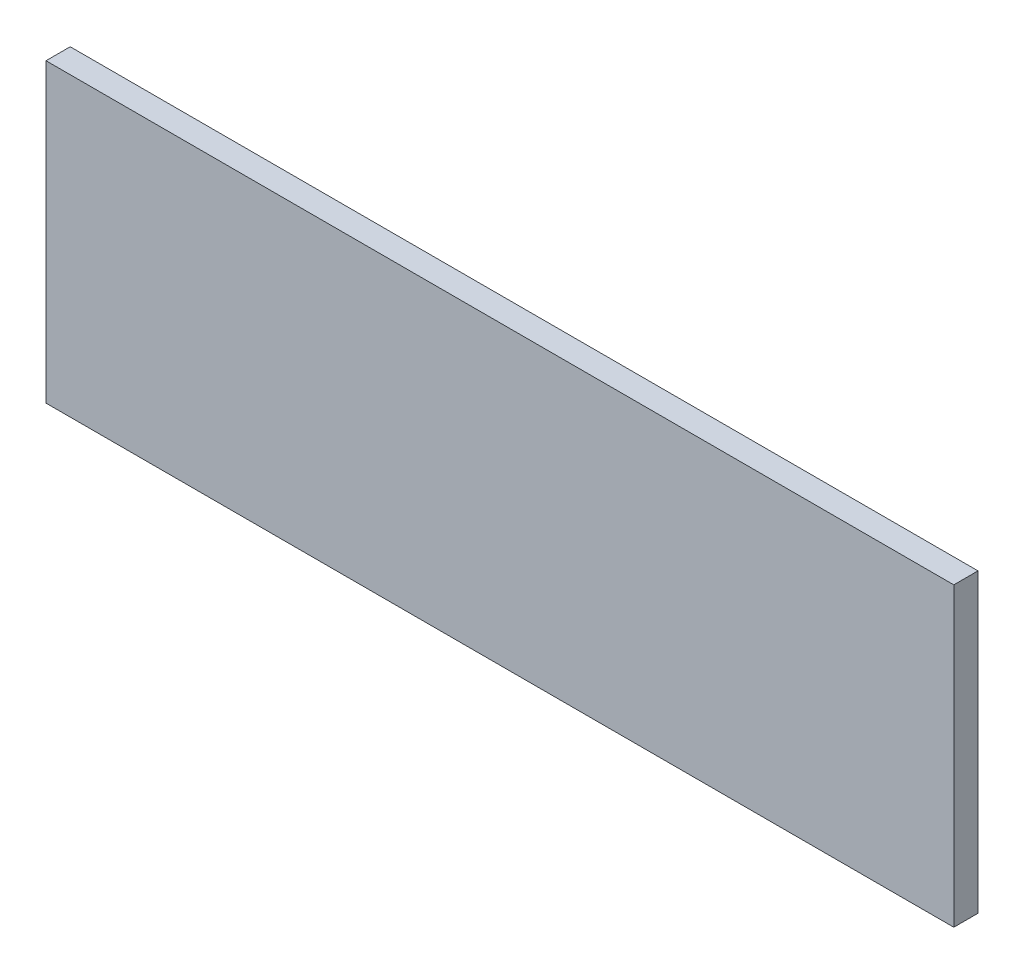
ISO-10303-21;
HEADER;
FILE_DESCRIPTION(('STEP AP214'),'2;1');
FILE_NAME('part.step','',(''),(''),'','','');
FILE_SCHEMA(('AUTOMOTIVE_DESIGN { 1 0 10303 214 1 1 1 1 }'));
ENDSEC;
DATA;
#1=APPLICATION_CONTEXT('core data for automotive mechanical design processes');
#2=APPLICATION_PROTOCOL_DEFINITION('international standard','automotive_design',2000,#1);
#3=PRODUCT_CONTEXT('',#1,'mechanical');
#4=PRODUCT('Part','Part','',(#3));
#5=PRODUCT_RELATED_PRODUCT_CATEGORY('part','',(#4));
#6=PRODUCT_DEFINITION_FORMATION('','',#4);
#7=PRODUCT_DEFINITION_CONTEXT('part definition',#1,'design');
#8=PRODUCT_DEFINITION('design','',#6,#7);
#9=PRODUCT_DEFINITION_SHAPE('','',#8);
#10=(LENGTH_UNIT() NAMED_UNIT(*) SI_UNIT(.MILLI.,.METRE.));
#11=(NAMED_UNIT(*) PLANE_ANGLE_UNIT() SI_UNIT($,.RADIAN.));
#12=(NAMED_UNIT(*) SI_UNIT($,.STERADIAN.) SOLID_ANGLE_UNIT());
#13=UNCERTAINTY_MEASURE_WITH_UNIT(LENGTH_MEASURE(1.E-05),#10,'distance_accuracy_value','');
#14=(GEOMETRIC_REPRESENTATION_CONTEXT(3) GLOBAL_UNCERTAINTY_ASSIGNED_CONTEXT((#13)) GLOBAL_UNIT_ASSIGNED_CONTEXT((#10,
#11,#12)) REPRESENTATION_CONTEXT('',''));
#15=CARTESIAN_POINT('',(0.,0.,0.));
#16=DIRECTION('',(0.,0.,1.));
#17=DIRECTION('',(1.,0.,0.));
#18=AXIS2_PLACEMENT_3D('',#15,#16,#17);
#19=CARTESIAN_POINT('',(-37.5,12.25,2.));
#20=DIRECTION('',(1.,0.,0.));
#21=DIRECTION('',(0.,1.,0.));
#22=AXIS2_PLACEMENT_3D('',#19,#20,#21);
#23=PLANE('',#22);
#24=DIRECTION('',(0.,-1.,0.));
#25=VECTOR('',#24,1.);
#26=CARTESIAN_POINT('',(-37.5,12.25,0.));
#27=LINE('',#26,#25);
#28=CARTESIAN_POINT('',(-37.5,12.25,0.));
#29=VERTEX_POINT('',#28);
#30=CARTESIAN_POINT('',(-37.5,-12.25,0.));
#31=VERTEX_POINT('',#30);
#32=EDGE_CURVE('E94',#29,#31,#27,.T.);
#33=ORIENTED_EDGE('',*,*,#32,.T.);
#34=DIRECTION('',(0.,0.,-1.));
#35=VECTOR('',#34,1.);
#36=CARTESIAN_POINT('',(-37.5,-12.25,2.));
#37=LINE('',#36,#35);
#38=CARTESIAN_POINT('',(-37.5,-12.25,2.));
#39=VERTEX_POINT('',#38);
#40=EDGE_CURVE('E11',#39,#31,#37,.T.);
#41=ORIENTED_EDGE('',*,*,#40,.F.);
#42=DIRECTION('',(0.,-1.,0.));
#43=VECTOR('',#42,1.);
#44=CARTESIAN_POINT('',(-37.5,12.25,2.));
#45=LINE('',#44,#43);
#46=CARTESIAN_POINT('',(-37.5,12.25,2.));
#47=VERTEX_POINT('',#46);
#48=EDGE_CURVE('E82',#47,#39,#45,.T.);
#49=ORIENTED_EDGE('',*,*,#48,.F.);
#50=DIRECTION('',(0.,0.,-1.));
#51=VECTOR('',#50,1.);
#52=CARTESIAN_POINT('',(-37.5,12.25,2.));
#53=LINE('',#52,#51);
#54=EDGE_CURVE('E90',#47,#29,#53,.T.);
#55=ORIENTED_EDGE('',*,*,#54,.T.);
#56=EDGE_LOOP('',(#33,#41,#49,#55));
#57=FACE_BOUND('',#56,.T.);
#58=ADVANCED_FACE('F31',(#57),#23,.F.);
#59=CARTESIAN_POINT('',(37.5,-12.25,2.));
#60=DIRECTION('',(0.,1.,0.));
#61=DIRECTION('',(-1.,0.,0.));
#62=AXIS2_PLACEMENT_3D('',#59,#60,#61);
#63=PLANE('',#62);
#64=DIRECTION('',(1.,0.,0.));
#65=VECTOR('',#64,1.);
#66=CARTESIAN_POINT('',(37.5,-12.25,0.));
#67=LINE('',#66,#65);
#68=CARTESIAN_POINT('',(37.5,-12.25,0.));
#69=VERTEX_POINT('',#68);
#70=EDGE_CURVE('E86',#31,#69,#67,.T.);
#71=ORIENTED_EDGE('',*,*,#70,.T.);
#72=DIRECTION('',(0.,0.,-1.));
#73=VECTOR('',#72,1.);
#74=CARTESIAN_POINT('',(37.5,-12.25,2.));
#75=LINE('',#74,#73);
#76=CARTESIAN_POINT('',(37.5,-12.25,2.));
#77=VERTEX_POINT('',#76);
#78=EDGE_CURVE('E39',#77,#69,#75,.T.);
#79=ORIENTED_EDGE('',*,*,#78,.F.);
#80=DIRECTION('',(1.,0.,0.));
#81=VECTOR('',#80,1.);
#82=CARTESIAN_POINT('',(37.5,-12.25,2.));
#83=LINE('',#82,#81);
#84=EDGE_CURVE('E77',#39,#77,#83,.T.);
#85=ORIENTED_EDGE('',*,*,#84,.F.);
#86=ORIENTED_EDGE('',*,*,#40,.T.);
#87=EDGE_LOOP('',(#71,#79,#85,#86));
#88=FACE_BOUND('',#87,.T.);
#89=ADVANCED_FACE('F85',(#88),#63,.F.);
#90=CARTESIAN_POINT('',(37.5,12.25,2.));
#91=DIRECTION('',(-1.,0.,0.));
#92=DIRECTION('',(0.,0.,1.));
#93=AXIS2_PLACEMENT_3D('',#90,#91,#92);
#94=PLANE('',#93);
#95=DIRECTION('',(0.,1.,0.));
#96=VECTOR('',#95,1.);
#97=CARTESIAN_POINT('',(37.5,12.25,0.));
#98=LINE('',#97,#96);
#99=CARTESIAN_POINT('',(37.5,12.25,0.));
#100=VERTEX_POINT('',#99);
#101=EDGE_CURVE('E64',#69,#100,#98,.T.);
#102=ORIENTED_EDGE('',*,*,#101,.T.);
#103=DIRECTION('',(0.,0.,-1.));
#104=VECTOR('',#103,1.);
#105=CARTESIAN_POINT('',(37.5,12.25,2.));
#106=LINE('',#105,#104);
#107=CARTESIAN_POINT('',(37.5,12.25,2.));
#108=VERTEX_POINT('',#107);
#109=EDGE_CURVE('E87',#108,#100,#106,.T.);
#110=ORIENTED_EDGE('',*,*,#109,.F.);
#111=DIRECTION('',(0.,1.,0.));
#112=VECTOR('',#111,1.);
#113=CARTESIAN_POINT('',(37.5,12.25,2.));
#114=LINE('',#113,#112);
#115=EDGE_CURVE('E80',#77,#108,#114,.T.);
#116=ORIENTED_EDGE('',*,*,#115,.F.);
#117=ORIENTED_EDGE('',*,*,#78,.T.);
#118=EDGE_LOOP('',(#102,#110,#116,#117));
#119=FACE_BOUND('',#118,.T.);
#120=ADVANCED_FACE('F88',(#119),#94,.F.);
#121=CARTESIAN_POINT('',(37.5,12.25,2.));
#122=DIRECTION('',(0.,-1.,0.));
#123=DIRECTION('',(1.,0.,0.));
#124=AXIS2_PLACEMENT_3D('',#121,#122,#123);
#125=PLANE('',#124);
#126=DIRECTION('',(-1.,0.,0.));
#127=VECTOR('',#126,1.);
#128=CARTESIAN_POINT('',(37.5,12.25,0.));
#129=LINE('',#128,#127);
#130=EDGE_CURVE('E70',#100,#29,#129,.T.);
#131=ORIENTED_EDGE('',*,*,#130,.T.);
#132=ORIENTED_EDGE('',*,*,#54,.F.);
#133=DIRECTION('',(-1.,0.,0.));
#134=VECTOR('',#133,1.);
#135=CARTESIAN_POINT('',(37.5,12.25,2.));
#136=LINE('',#135,#134);
#137=EDGE_CURVE('E47',#108,#47,#136,.T.);
#138=ORIENTED_EDGE('',*,*,#137,.F.);
#139=ORIENTED_EDGE('',*,*,#109,.T.);
#140=EDGE_LOOP('',(#131,#132,#138,#139));
#141=FACE_BOUND('',#140,.T.);
#142=ADVANCED_FACE('F101',(#141),#125,.F.);
#143=CARTESIAN_POINT('',(-37.5,-12.25,2.));
#144=DIRECTION('',(0.,0.,-1.));
#145=DIRECTION('',(-1.,0.,0.));
#146=AXIS2_PLACEMENT_3D('',#143,#144,#145);
#147=PLANE('',#146);
#148=ORIENTED_EDGE('',*,*,#48,.T.);
#149=ORIENTED_EDGE('',*,*,#84,.T.);
#150=ORIENTED_EDGE('',*,*,#115,.T.);
#151=ORIENTED_EDGE('',*,*,#137,.T.);
#152=EDGE_LOOP('',(#148,#149,#150,#151));
#153=FACE_BOUND('',#152,.T.);
#154=ADVANCED_FACE('F78',(#153),#147,.F.);
#155=CARTESIAN_POINT('',(-37.5,-12.25,0.));
#156=DIRECTION('',(0.,0.,-1.));
#157=DIRECTION('',(-1.,0.,0.));
#158=AXIS2_PLACEMENT_3D('',#155,#156,#157);
#159=PLANE('',#158);
#160=ORIENTED_EDGE('',*,*,#32,.F.);
#161=ORIENTED_EDGE('',*,*,#130,.F.);
#162=ORIENTED_EDGE('',*,*,#101,.F.);
#163=ORIENTED_EDGE('',*,*,#70,.F.);
#164=EDGE_LOOP('',(#160,#161,#162,#163));
#165=FACE_BOUND('',#164,.T.);
#166=ADVANCED_FACE('F104',(#165),#159,.T.);
#167=CLOSED_SHELL('',(#58,#89,#120,#142,#154,#166));
#168=MANIFOLD_SOLID_BREP('B2',#167);
#169=ADVANCED_BREP_SHAPE_REPRESENTATION('',(#18,#168),#14);
#170=SHAPE_DEFINITION_REPRESENTATION(#9,#169);
ENDSEC;
END-ISO-10303-21;
